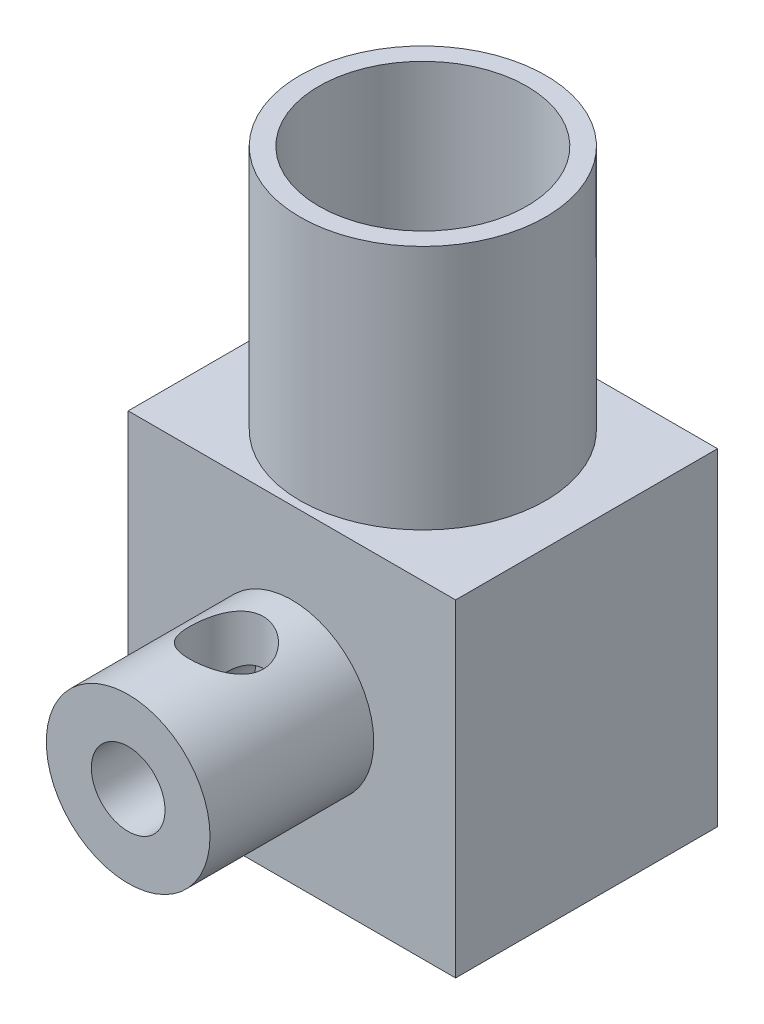
ISO-10303-21;
HEADER;
FILE_DESCRIPTION(('STEP AP214'),'2;1');
FILE_NAME('part.step','',(''),(''),'','','');
FILE_SCHEMA(('AUTOMOTIVE_DESIGN { 1 0 10303 214 1 1 1 1 }'));
ENDSEC;
DATA;
#1=APPLICATION_CONTEXT('core data for automotive mechanical design processes');
#2=APPLICATION_PROTOCOL_DEFINITION('international standard','automotive_design',2000,#1);
#3=PRODUCT_CONTEXT('',#1,'mechanical');
#4=PRODUCT('Part','Part','',(#3));
#5=PRODUCT_RELATED_PRODUCT_CATEGORY('part','',(#4));
#6=PRODUCT_DEFINITION_FORMATION('','',#4);
#7=PRODUCT_DEFINITION_CONTEXT('part definition',#1,'design');
#8=PRODUCT_DEFINITION('design','',#6,#7);
#9=PRODUCT_DEFINITION_SHAPE('','',#8);
#10=(LENGTH_UNIT() NAMED_UNIT(*) SI_UNIT(.MILLI.,.METRE.));
#11=(NAMED_UNIT(*) PLANE_ANGLE_UNIT() SI_UNIT($,.RADIAN.));
#12=(NAMED_UNIT(*) SI_UNIT($,.STERADIAN.) SOLID_ANGLE_UNIT());
#13=UNCERTAINTY_MEASURE_WITH_UNIT(LENGTH_MEASURE(1.E-05),#10,'distance_accuracy_value','');
#14=(GEOMETRIC_REPRESENTATION_CONTEXT(3) GLOBAL_UNCERTAINTY_ASSIGNED_CONTEXT((#13)) GLOBAL_UNIT_ASSIGNED_CONTEXT((#10,
#11,#12)) REPRESENTATION_CONTEXT('',''));
#15=CARTESIAN_POINT('',(0.,0.,0.));
#16=DIRECTION('',(0.,0.,1.));
#17=DIRECTION('',(1.,0.,0.));
#18=AXIS2_PLACEMENT_3D('',#15,#16,#17);
#19=CARTESIAN_POINT('',(10.,-10.,16.));
#20=DIRECTION('',(-1.,0.,0.));
#21=DIRECTION('',(0.,0.,1.));
#22=AXIS2_PLACEMENT_3D('',#19,#20,#21);
#23=PLANE('',#22);
#24=DIRECTION('',(0.,1.,0.));
#25=VECTOR('',#24,1.);
#26=CARTESIAN_POINT('',(10.,-10.,0.));
#27=LINE('',#26,#25);
#28=CARTESIAN_POINT('',(10.,-10.,0.));
#29=VERTEX_POINT('',#28);
#30=CARTESIAN_POINT('',(10.,10.,0.));
#31=VERTEX_POINT('',#30);
#32=EDGE_CURVE('E134',#29,#31,#27,.T.);
#33=ORIENTED_EDGE('',*,*,#32,.T.);
#34=DIRECTION('',(0.,0.,-1.));
#35=VECTOR('',#34,1.);
#36=CARTESIAN_POINT('',(10.,10.,16.));
#37=LINE('',#36,#35);
#38=CARTESIAN_POINT('',(10.,10.,16.));
#39=VERTEX_POINT('',#38);
#40=EDGE_CURVE('E138',#39,#31,#37,.T.);
#41=ORIENTED_EDGE('',*,*,#40,.F.);
#42=DIRECTION('',(0.,1.,0.));
#43=VECTOR('',#42,1.);
#44=CARTESIAN_POINT('',(10.,-10.,16.));
#45=LINE('',#44,#43);
#46=CARTESIAN_POINT('',(10.,-10.,16.));
#47=VERTEX_POINT('',#46);
#48=EDGE_CURVE('E140',#47,#39,#45,.T.);
#49=ORIENTED_EDGE('',*,*,#48,.F.);
#50=DIRECTION('',(0.,0.,-1.));
#51=VECTOR('',#50,1.);
#52=CARTESIAN_POINT('',(10.,-10.,16.));
#53=LINE('',#52,#51);
#54=EDGE_CURVE('E150',#47,#29,#53,.T.);
#55=ORIENTED_EDGE('',*,*,#54,.T.);
#56=EDGE_LOOP('',(#33,#41,#49,#55));
#57=FACE_BOUND('',#56,.T.);
#58=ADVANCED_FACE('F44',(#57),#23,.F.);
#59=CARTESIAN_POINT('',(-10.,10.,16.));
#60=DIRECTION('',(0.,-1.,0.));
#61=DIRECTION('',(0.,0.,-1.));
#62=AXIS2_PLACEMENT_3D('',#59,#60,#61);
#63=PLANE('',#62);
#64=CARTESIAN_POINT('',(0.,10.,8.));
#65=DIRECTION('',(0.,1.,0.));
#66=DIRECTION('',(0.,0.,1.));
#67=AXIS2_PLACEMENT_3D('',#64,#65,#66);
#68=CIRCLE('',#67,7.5);
#69=CARTESIAN_POINT('',(0.,10.,15.5));
#70=VERTEX_POINT('',#69);
#71=EDGE_CURVE('E103',#70,#70,#68,.T.);
#72=ORIENTED_EDGE('',*,*,#71,.F.);
#73=EDGE_LOOP('',(#72));
#74=FACE_BOUND('',#73,.T.);
#75=DIRECTION('',(-1.,0.,0.));
#76=VECTOR('',#75,1.);
#77=CARTESIAN_POINT('',(-10.,10.,0.));
#78=LINE('',#77,#76);
#79=CARTESIAN_POINT('',(-10.,10.,0.));
#80=VERTEX_POINT('',#79);
#81=EDGE_CURVE('E154',#31,#80,#78,.T.);
#82=ORIENTED_EDGE('',*,*,#81,.T.);
#83=DIRECTION('',(0.,0.,-1.));
#84=VECTOR('',#83,1.);
#85=CARTESIAN_POINT('',(-10.,10.,16.));
#86=LINE('',#85,#84);
#87=CARTESIAN_POINT('',(-10.,10.,16.));
#88=VERTEX_POINT('',#87);
#89=EDGE_CURVE('E165',#88,#80,#86,.T.);
#90=ORIENTED_EDGE('',*,*,#89,.F.);
#91=DIRECTION('',(-1.,0.,0.));
#92=VECTOR('',#91,1.);
#93=CARTESIAN_POINT('',(-10.,10.,16.));
#94=LINE('',#93,#92);
#95=EDGE_CURVE('E92',#39,#88,#94,.T.);
#96=ORIENTED_EDGE('',*,*,#95,.F.);
#97=ORIENTED_EDGE('',*,*,#40,.T.);
#98=EDGE_LOOP('',(#82,#90,#96,#97));
#99=FACE_BOUND('',#98,.T.);
#100=ADVANCED_FACE('F167',(#74,#99),#63,.F.);
#101=CARTESIAN_POINT('',(-10.,-10.,16.));
#102=DIRECTION('',(1.,0.,0.));
#103=DIRECTION('',(0.,0.,-1.));
#104=AXIS2_PLACEMENT_3D('',#101,#102,#103);
#105=PLANE('',#104);
#106=DIRECTION('',(0.,-1.,0.));
#107=VECTOR('',#106,1.);
#108=CARTESIAN_POINT('',(-10.,-10.,0.));
#109=LINE('',#108,#107);
#110=CARTESIAN_POINT('',(-10.,-10.,0.));
#111=VERTEX_POINT('',#110);
#112=EDGE_CURVE('E153',#80,#111,#109,.T.);
#113=ORIENTED_EDGE('',*,*,#112,.T.);
#114=DIRECTION('',(0.,0.,-1.));
#115=VECTOR('',#114,1.);
#116=CARTESIAN_POINT('',(-10.,-10.,16.));
#117=LINE('',#116,#115);
#118=CARTESIAN_POINT('',(-10.,-10.,16.));
#119=VERTEX_POINT('',#118);
#120=EDGE_CURVE('E163',#119,#111,#117,.T.);
#121=ORIENTED_EDGE('',*,*,#120,.F.);
#122=DIRECTION('',(0.,-1.,0.));
#123=VECTOR('',#122,1.);
#124=CARTESIAN_POINT('',(-10.,-10.,16.));
#125=LINE('',#124,#123);
#126=EDGE_CURVE('E145',#88,#119,#125,.T.);
#127=ORIENTED_EDGE('',*,*,#126,.F.);
#128=ORIENTED_EDGE('',*,*,#89,.T.);
#129=EDGE_LOOP('',(#113,#121,#127,#128));
#130=FACE_BOUND('',#129,.T.);
#131=ADVANCED_FACE('F177',(#130),#105,.F.);
#132=CARTESIAN_POINT('',(-10.,-10.,16.));
#133=DIRECTION('',(0.,1.,0.));
#134=DIRECTION('',(0.,0.,1.));
#135=AXIS2_PLACEMENT_3D('',#132,#133,#134);
#136=PLANE('',#135);
#137=DIRECTION('',(1.,0.,0.));
#138=VECTOR('',#137,1.);
#139=CARTESIAN_POINT('',(-10.,-10.,0.));
#140=LINE('',#139,#138);
#141=EDGE_CURVE('E86',#111,#29,#140,.T.);
#142=ORIENTED_EDGE('',*,*,#141,.T.);
#143=ORIENTED_EDGE('',*,*,#54,.F.);
#144=DIRECTION('',(1.,0.,0.));
#145=VECTOR('',#144,1.);
#146=CARTESIAN_POINT('',(-10.,-10.,16.));
#147=LINE('',#146,#145);
#148=EDGE_CURVE('E69',#119,#47,#147,.T.);
#149=ORIENTED_EDGE('',*,*,#148,.F.);
#150=ORIENTED_EDGE('',*,*,#120,.T.);
#151=EDGE_LOOP('',(#142,#143,#149,#150));
#152=FACE_BOUND('',#151,.T.);
#153=ADVANCED_FACE('F181',(#152),#136,.F.);
#154=CARTESIAN_POINT('',(0.,0.,16.));
#155=DIRECTION('',(0.,0.,-1.));
#156=DIRECTION('',(-1.,0.,0.));
#157=AXIS2_PLACEMENT_3D('',#154,#155,#156);
#158=PLANE('',#157);
#159=CARTESIAN_POINT('',(0.,0.,16.));
#160=DIRECTION('',(0.,0.,1.));
#161=DIRECTION('',(1.,0.,0.));
#162=AXIS2_PLACEMENT_3D('',#159,#160,#161);
#163=CIRCLE('',#162,5.);
#164=CARTESIAN_POINT('',(5.,0.,16.));
#165=VERTEX_POINT('',#164);
#166=EDGE_CURVE('E131',#165,#165,#163,.T.);
#167=ORIENTED_EDGE('',*,*,#166,.F.);
#168=EDGE_LOOP('',(#167));
#169=FACE_BOUND('',#168,.T.);
#170=ORIENTED_EDGE('',*,*,#48,.T.);
#171=ORIENTED_EDGE('',*,*,#95,.T.);
#172=ORIENTED_EDGE('',*,*,#126,.T.);
#173=ORIENTED_EDGE('',*,*,#148,.T.);
#174=EDGE_LOOP('',(#170,#171,#172,#173));
#175=FACE_BOUND('',#174,.T.);
#176=ADVANCED_FACE('F185',(#169,#175),#158,.F.);
#177=CARTESIAN_POINT('',(0.,0.,0.));
#178=DIRECTION('',(0.,0.,-1.));
#179=DIRECTION('',(-1.,0.,0.));
#180=AXIS2_PLACEMENT_3D('',#177,#178,#179);
#181=PLANE('',#180);
#182=ORIENTED_EDGE('',*,*,#32,.F.);
#183=ORIENTED_EDGE('',*,*,#141,.F.);
#184=ORIENTED_EDGE('',*,*,#112,.F.);
#185=ORIENTED_EDGE('',*,*,#81,.F.);
#186=EDGE_LOOP('',(#182,#183,#184,#185));
#187=FACE_BOUND('',#186,.T.);
#188=ADVANCED_FACE('F174',(#187),#181,.T.);
#189=CARTESIAN_POINT('',(0.,0.,26.));
#190=DIRECTION('',(0.,0.,1.));
#191=DIRECTION('',(1.,0.,0.));
#192=AXIS2_PLACEMENT_3D('',#189,#190,#191);
#193=PLANE('',#192);
#194=CARTESIAN_POINT('',(0.,0.,26.));
#195=DIRECTION('',(0.,0.,1.));
#196=DIRECTION('',(1.,0.,0.));
#197=AXIS2_PLACEMENT_3D('',#194,#195,#196);
#198=CIRCLE('',#197,5.);
#199=CARTESIAN_POINT('',(5.,0.,26.));
#200=VERTEX_POINT('',#199);
#201=EDGE_CURVE('E122',#200,#200,#198,.T.);
#202=ORIENTED_EDGE('',*,*,#201,.T.);
#203=EDGE_LOOP('',(#202));
#204=FACE_BOUND('',#203,.T.);
#205=CARTESIAN_POINT('',(0.,0.,26.));
#206=DIRECTION('',(0.,0.,1.));
#207=DIRECTION('',(1.,0.,0.));
#208=AXIS2_PLACEMENT_3D('',#205,#206,#207);
#209=CIRCLE('',#208,2.25);
#210=CARTESIAN_POINT('',(2.25,0.,26.));
#211=VERTEX_POINT('',#210);
#212=EDGE_CURVE('E111',#211,#211,#209,.T.);
#213=ORIENTED_EDGE('',*,*,#212,.F.);
#214=EDGE_LOOP('',(#213));
#215=FACE_BOUND('',#214,.T.);
#216=ADVANCED_FACE('F188',(#204,#215),#193,.T.);
#217=CARTESIAN_POINT('',(0.,0.,26.));
#218=DIRECTION('',(0.,0.,-1.));
#219=DIRECTION('',(-1.,0.,0.));
#220=AXIS2_PLACEMENT_3D('',#217,#218,#219);
#221=CYLINDRICAL_SURFACE('',#220,5.);
#222=CARTESIAN_POINT('',(0.,5.,22.25));
#223=CARTESIAN_POINT('',(-0.119657163872058,4.9999951803291,22.2499941508325));
#224=CARTESIAN_POINT('',(-0.239497209577402,4.99565681806759,22.240398554356));
#225=CARTESIAN_POINT('',(-0.475720816707711,4.97873356251569,22.2024004970845));
#226=CARTESIAN_POINT('',(-0.592095550925141,4.96612922657762,22.1739536941356));
#227=CARTESIAN_POINT('',(-0.817598389702704,4.93401032574636,22.0995417374731));
#228=CARTESIAN_POINT('',(-0.926750955125895,4.91452067131296,22.0536396901104));
#229=CARTESIAN_POINT('',(-1.13568251878513,4.87048664392257,21.945906304151));
#230=CARTESIAN_POINT('',(-1.23546350613327,4.84594334714473,21.8840783562912));
#231=CARTESIAN_POINT('',(-1.42864166958965,4.7926545488551,21.7425702502373));
#232=CARTESIAN_POINT('',(-1.52144083505235,4.76375726911886,21.6621315255467));
#233=CARTESIAN_POINT('',(-1.69276142751265,4.7056093324505,21.4872976020405));
#234=CARTESIAN_POINT('',(-1.77127412914543,4.67635847112187,21.3928939376057));
#235=CARTESIAN_POINT('',(-1.91644184676257,4.61884309478044,21.1860212054054));
#236=CARTESIAN_POINT('',(-1.98211224629651,4.59074106078138,21.0728110950827));
#237=CARTESIAN_POINT('',(-2.09321326547296,4.54116574662787,20.8355185417193));
#238=CARTESIAN_POINT('',(-2.13865597929338,4.51968850785886,20.7114426486112));
#239=CARTESIAN_POINT('',(-2.2054422070107,4.48746493874362,20.462806781862));
#240=CARTESIAN_POINT('',(-2.22794402601262,4.47620638732559,20.3386271752549));
#241=CARTESIAN_POINT('',(-2.25180742161623,4.46425372050826,20.0877845994371));
#242=CARTESIAN_POINT('',(-2.25318367120293,4.46355227256902,19.9611234150613));
#243=CARTESIAN_POINT('',(-2.23561914182213,4.4723671338535,19.7214180581905));
#244=CARTESIAN_POINT('',(-2.2185407575292,4.48094689435861,19.6081955432716));
#245=CARTESIAN_POINT('',(-2.16771485945775,4.5057522601785,19.3864380235561));
#246=CARTESIAN_POINT('',(-2.13396347414753,4.52197964125845,19.2779041138392));
#247=CARTESIAN_POINT('',(-2.05008139659869,4.56062840437285,19.0656613346161));
#248=CARTESIAN_POINT('',(-1.99959732959401,4.58318164475399,18.9621172350035));
#249=CARTESIAN_POINT('',(-1.88393825005055,4.63192287969266,18.7645259052392));
#250=CARTESIAN_POINT('',(-1.81875698614686,4.65811241910162,18.6704827409736));
#251=CARTESIAN_POINT('',(-1.66791131474515,4.71435794303027,18.4846493257256));
#252=CARTESIAN_POINT('',(-1.58084940988695,4.74453849261979,18.394027618604));
#253=CARTESIAN_POINT('',(-1.39252160551636,4.80318714257221,18.2282416628495));
#254=CARTESIAN_POINT('',(-1.2912512139917,4.83165469728905,18.1530823212481));
#255=CARTESIAN_POINT('',(-1.07332333935315,4.88476427737967,18.0182362246468));
#256=CARTESIAN_POINT('',(-0.956286364396324,4.90926046885464,17.9591009344205));
#257=CARTESIAN_POINT('',(-0.712539817711663,4.95050723789684,17.8617820285451));
#258=CARTESIAN_POINT('',(-0.585836558945027,4.96726282117482,17.8235848695963));
#259=CARTESIAN_POINT('',(-0.336050927795546,4.99015693100556,17.7718479933816));
#260=CARTESIAN_POINT('',(-0.213354125401067,4.99696705652231,17.7567448896773));
#261=CARTESIAN_POINT('',(0.0330028549596151,5.00140648285731,17.7468706262329));
#262=CARTESIAN_POINT('',(0.156662679358168,4.99903900798532,17.7520923259077));
#263=CARTESIAN_POINT('',(0.39360639710269,4.98581223187087,17.7816725282754));
#264=CARTESIAN_POINT('',(0.507068143127038,4.97547003197285,17.8048661216162));
#265=CARTESIAN_POINT('',(0.728326171242956,4.94792660884623,17.8680331296803));
#266=CARTESIAN_POINT('',(0.836121769198289,4.93072455949595,17.908008565447));
#267=CARTESIAN_POINT('',(1.0468032844483,4.89040595603713,18.0048645461602));
#268=CARTESIAN_POINT('',(1.14943204917316,4.86712201520423,18.0622324242414));
#269=CARTESIAN_POINT('',(1.34397554623912,4.81703610915173,18.1917138422135));
#270=CARTESIAN_POINT('',(1.43588556437494,4.79023260693119,18.2638338321065));
#271=CARTESIAN_POINT('',(1.61437331335905,4.73321088066406,18.427690333341));
#272=CARTESIAN_POINT('',(1.69988735602747,4.70289328565378,18.5205536670442));
#273=CARTESIAN_POINT('',(1.85448776672914,4.64410716992065,18.7196605639014));
#274=CARTESIAN_POINT('',(1.92356783385003,4.61563936145101,18.8259092352926));
#275=CARTESIAN_POINT('',(2.0448687723509,4.56322301354684,19.0524119938838));
#276=CARTESIAN_POINT('',(2.0966129511578,4.53940877273745,19.1729549150335));
#277=CARTESIAN_POINT('',(2.17856642952346,4.50065987671192,19.4224663797287));
#278=CARTESIAN_POINT('',(2.20879749107799,4.48571625080529,19.5514262643155));
#279=CARTESIAN_POINT('',(2.24454528993165,4.46792778615278,19.802147412113));
#280=CARTESIAN_POINT('',(2.25196758692373,4.46415115998432,19.9235711103763));
#281=CARTESIAN_POINT('',(2.24714266058781,4.46658268326981,20.1659106486577));
#282=CARTESIAN_POINT('',(2.23489992569103,4.47278855427626,20.2868265982513));
#283=CARTESIAN_POINT('',(2.19277345398221,4.49357716344734,20.5167678221568));
#284=CARTESIAN_POINT('',(2.16405328461859,4.50760581250428,20.6260616630034));
#285=CARTESIAN_POINT('',(2.09103437001123,4.54193721731516,20.8382569690474));
#286=CARTESIAN_POINT('',(2.04673109152543,4.56224179857571,20.9411565638507));
#287=CARTESIAN_POINT('',(1.94052895513635,4.60845986490249,21.1449425819386));
#288=CARTESIAN_POINT('',(1.87767694712305,4.63465129287797,21.245267781668));
#289=CARTESIAN_POINT('',(1.7373806274927,4.68904747578369,21.4345379466943));
#290=CARTESIAN_POINT('',(1.65993003008871,4.71725309471255,21.5234779820221));
#291=CARTESIAN_POINT('',(1.48434630972136,4.77556462695219,21.6957826227624));
#292=CARTESIAN_POINT('',(1.3849750965528,4.8056111870999,21.7779120561799));
#293=CARTESIAN_POINT('',(1.17282336441816,4.8617393821882,21.9244746098652));
#294=CARTESIAN_POINT('',(1.06003671208436,4.88781919106815,21.9888995909801));
#295=CARTESIAN_POINT('',(0.825071548433893,4.93289199970098,22.0972194043048));
#296=CARTESIAN_POINT('',(0.702997935707183,4.95195309116145,22.1413126019502));
#297=CARTESIAN_POINT('',(0.452281842298328,4.9810892043169,22.2078630803421));
#298=CARTESIAN_POINT('',(0.323660544978673,4.9911914716417,22.2303859776352));
#299=CARTESIAN_POINT('',(0.161835421205044,4.99748612119021,22.244407857878));
#300=CARTESIAN_POINT('',(0.129515019999638,4.99842714593435,22.2465028809597));
#301=CARTESIAN_POINT('',(0.0648008846979554,4.99968474227602,22.2492997536287));
#302=CARTESIAN_POINT('',(0.032407149604151,5.00000130532758,22.2500015841496));
#303=CARTESIAN_POINT('',(0.,5.,22.25));
#304=B_SPLINE_CURVE_WITH_KNOTS('',3,(#222,#223,#224,#225,#226,#227,#228,#229,#230,#231,#232,
#233,#234,#235,#236,#237,#238,#239,#240,#241,#242,#243,#244,#245,#246,#247,#248,#249,#250,#251,
#252,#253,#254,#255,#256,#257,#258,#259,#260,#261,#262,#263,#264,#265,#266,#267,#268,#269,#270,
#271,#272,#273,#274,#275,#276,#277,#278,#279,#280,#281,#282,#283,#284,#285,#286,#287,#288,#289,
#290,#291,#292,#293,#294,#295,#296,#297,#298,#299,#300,#301,#302,#303),.UNSPECIFIED.,.T.,.F.,(4,
2,2,2,2,2,2,2,2,2,2,2,2,2,2,2,2,2,2,2,2,2,2,2,2,2,2,2,2,2,2,2,2,2,2,2,2,2,2,2,4),(0.,
0.358838474045363,0.718524024886283,1.07692137234717,1.43524247745089,1.81211589040082,
2.18921870938887,2.58877923399088,2.98810053852174,3.36607753259061,3.74379198689987,
4.08666490416552,4.42961747522457,4.78033096378956,5.13119390858612,5.51719011281457,
5.90330862586185,6.30138888099423,6.69921134324785,7.06867955514896,7.43801797582675,
7.78523528011159,8.13249441190393,8.49055929702834,8.84878107324682,9.23652488450211,
9.62441712097652,10.0222360675986,10.4196520187761,10.782814484147,11.1458940715369,
11.486031651511,11.8262682619787,12.1885231613985,12.5509343964944,12.9461798591982,
13.3416067227122,13.7330894595624,14.1233774929092,14.2205615861382,14.3177470093574),.UNSPECIFIED.);
#305=CARTESIAN_POINT('',(0.,5.,22.25));
#306=VERTEX_POINT('',#305);
#307=EDGE_CURVE('E227',#306,#306,#304,.T.);
#308=ORIENTED_EDGE('',*,*,#307,.T.);
#309=EDGE_LOOP('',(#308));
#310=FACE_BOUND('',#309,.T.);
#311=ORIENTED_EDGE('',*,*,#201,.F.);
#312=EDGE_LOOP('',(#311));
#313=FACE_BOUND('',#312,.T.);
#314=ORIENTED_EDGE('',*,*,#166,.T.);
#315=EDGE_LOOP('',(#314));
#316=FACE_BOUND('',#315,.T.);
#317=ADVANCED_FACE('F106',(#310,#313,#316),#221,.T.);
#318=CARTESIAN_POINT('',(0.,0.,26.));
#319=DIRECTION('',(0.,0.,-1.));
#320=DIRECTION('',(-1.,0.,0.));
#321=AXIS2_PLACEMENT_3D('',#318,#319,#320);
#322=CYLINDRICAL_SURFACE('',#321,2.25);
#323=CARTESIAN_POINT('',(0.,0.,20.));
#324=DIRECTION('',(0.,0.707106781186547,-0.707106781186547));
#325=DIRECTION('',(0.,-0.707106781186547,-0.707106781186547));
#326=AXIS2_PLACEMENT_3D('',#323,#324,#325);
#327=ELLIPSE('',#326,3.18198051533946,2.25);
#328=CARTESIAN_POINT('',(2.25,0.,20.));
#329=VERTEX_POINT('',#328);
#330=CARTESIAN_POINT('',(-2.25,0.,20.));
#331=VERTEX_POINT('',#330);
#332=EDGE_CURVE('E11',#329,#331,#327,.F.);
#333=ORIENTED_EDGE('',*,*,#332,.F.);
#334=CARTESIAN_POINT('',(0.,0.,20.));
#335=DIRECTION('',(0.,-0.707106781186547,-0.707106781186547));
#336=DIRECTION('',(0.,0.707106781186547,-0.707106781186547));
#337=AXIS2_PLACEMENT_3D('',#334,#335,#336);
#338=ELLIPSE('',#337,3.18198051533946,2.25);
#339=EDGE_CURVE('E52',#331,#329,#338,.T.);
#340=ORIENTED_EDGE('',*,*,#339,.F.);
#341=EDGE_LOOP('',(#333,#340));
#342=FACE_BOUND('',#341,.T.);
#343=ORIENTED_EDGE('',*,*,#212,.T.);
#344=EDGE_LOOP('',(#343));
#345=FACE_BOUND('',#344,.T.);
#346=CARTESIAN_POINT('',(0.,0.,16.));
#347=DIRECTION('',(0.,0.,1.));
#348=DIRECTION('',(1.,0.,0.));
#349=AXIS2_PLACEMENT_3D('',#346,#347,#348);
#350=CIRCLE('',#349,2.25);
#351=CARTESIAN_POINT('',(2.25,0.,16.));
#352=VERTEX_POINT('',#351);
#353=EDGE_CURVE('E112',#352,#352,#350,.T.);
#354=ORIENTED_EDGE('',*,*,#353,.F.);
#355=EDGE_LOOP('',(#354));
#356=FACE_BOUND('',#355,.T.);
#357=ADVANCED_FACE('F105',(#342,#345,#356),#322,.F.);
#358=ORIENTED_EDGE('',*,*,#353,.T.);
#359=EDGE_LOOP('',(#358));
#360=FACE_BOUND('',#359,.T.);
#361=ADVANCED_FACE('F102',(#360),#158,.F.);
#362=CARTESIAN_POINT('',(0.,25.,8.));
#363=DIRECTION('',(0.,1.,0.));
#364=DIRECTION('',(0.,0.,1.));
#365=AXIS2_PLACEMENT_3D('',#362,#363,#364);
#366=PLANE('',#365);
#367=CARTESIAN_POINT('',(0.,25.,8.));
#368=DIRECTION('',(0.,1.,0.));
#369=DIRECTION('',(0.,0.,1.));
#370=AXIS2_PLACEMENT_3D('',#367,#368,#369);
#371=CIRCLE('',#370,7.5);
#372=CARTESIAN_POINT('',(0.,25.,15.5));
#373=VERTEX_POINT('',#372);
#374=EDGE_CURVE('E120',#373,#373,#371,.T.);
#375=ORIENTED_EDGE('',*,*,#374,.T.);
#376=EDGE_LOOP('',(#375));
#377=FACE_BOUND('',#376,.T.);
#378=CARTESIAN_POINT('',(0.,25.,8.));
#379=DIRECTION('',(0.,1.,0.));
#380=DIRECTION('',(0.,0.,1.));
#381=AXIS2_PLACEMENT_3D('',#378,#379,#380);
#382=CIRCLE('',#381,6.35);
#383=CARTESIAN_POINT('',(0.,25.,14.35));
#384=VERTEX_POINT('',#383);
#385=EDGE_CURVE('E121',#384,#384,#382,.T.);
#386=ORIENTED_EDGE('',*,*,#385,.F.);
#387=EDGE_LOOP('',(#386));
#388=FACE_BOUND('',#387,.T.);
#389=ADVANCED_FACE('F196',(#377,#388),#366,.T.);
#390=CARTESIAN_POINT('',(0.,25.,8.));
#391=DIRECTION('',(0.,-1.,0.));
#392=DIRECTION('',(0.,0.,-1.));
#393=AXIS2_PLACEMENT_3D('',#390,#391,#392);
#394=CYLINDRICAL_SURFACE('',#393,7.5);
#395=ORIENTED_EDGE('',*,*,#374,.F.);
#396=EDGE_LOOP('',(#395));
#397=FACE_BOUND('',#396,.T.);
#398=ORIENTED_EDGE('',*,*,#71,.T.);
#399=EDGE_LOOP('',(#398));
#400=FACE_BOUND('',#399,.T.);
#401=ADVANCED_FACE('F218',(#397,#400),#394,.T.);
#402=CARTESIAN_POINT('',(0.,25.,8.));
#403=DIRECTION('',(0.,-1.,0.));
#404=DIRECTION('',(0.,0.,-1.));
#405=AXIS2_PLACEMENT_3D('',#402,#403,#404);
#406=CYLINDRICAL_SURFACE('',#405,6.35);
#407=ORIENTED_EDGE('',*,*,#385,.T.);
#408=EDGE_LOOP('',(#407));
#409=FACE_BOUND('',#408,.T.);
#410=CARTESIAN_POINT('',(0.,10.,8.));
#411=DIRECTION('',(0.,1.,0.));
#412=DIRECTION('',(0.,0.,1.));
#413=AXIS2_PLACEMENT_3D('',#410,#411,#412);
#414=CIRCLE('',#413,6.35);
#415=CARTESIAN_POINT('',(0.,10.,14.35));
#416=VERTEX_POINT('',#415);
#417=EDGE_CURVE('E224',#416,#416,#414,.T.);
#418=ORIENTED_EDGE('',*,*,#417,.F.);
#419=EDGE_LOOP('',(#418));
#420=FACE_BOUND('',#419,.T.);
#421=ADVANCED_FACE('F212',(#409,#420),#406,.F.);
#422=ORIENTED_EDGE('',*,*,#417,.T.);
#423=EDGE_LOOP('',(#422));
#424=FACE_BOUND('',#423,.T.);
#425=ADVANCED_FACE('F204',(#424),#63,.F.);
#426=CARTESIAN_POINT('',(0.,0.,20.));
#427=DIRECTION('',(0.,1.,0.));
#428=DIRECTION('',(0.,0.,1.));
#429=AXIS2_PLACEMENT_3D('',#426,#427,#428);
#430=CYLINDRICAL_SURFACE('',#429,2.25);
#431=ORIENTED_EDGE('',*,*,#332,.T.);
#432=ORIENTED_EDGE('',*,*,#339,.T.);
#433=EDGE_LOOP('',(#431,#432));
#434=FACE_BOUND('',#433,.T.);
#435=ORIENTED_EDGE('',*,*,#307,.F.);
#436=EDGE_LOOP('',(#435));
#437=FACE_BOUND('',#436,.T.);
#438=ADVANCED_FACE('F97',(#434,#437),#430,.F.);
#439=CLOSED_SHELL('',(#58,#100,#131,#153,#176,#188,#216,#317,#357,#361,#389,#401,#421,#425,#438));
#440=MANIFOLD_SOLID_BREP('B2',#439);
#441=ADVANCED_BREP_SHAPE_REPRESENTATION('',(#18,#440),#14);
#442=SHAPE_DEFINITION_REPRESENTATION(#9,#441);
ENDSEC;
END-ISO-10303-21;
